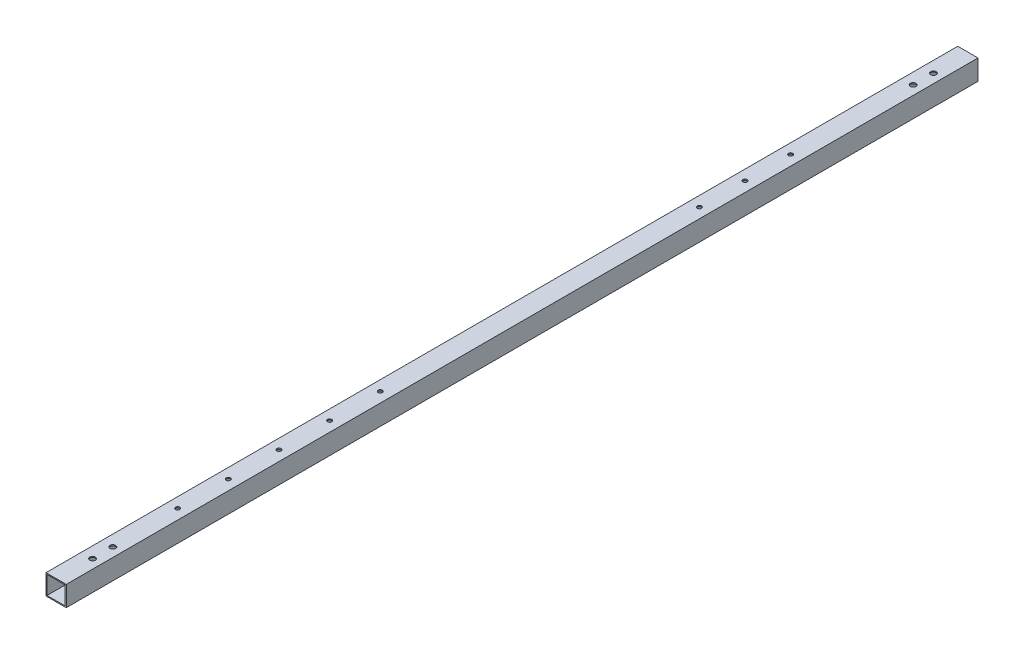
ISO-10303-21;
HEADER;
FILE_DESCRIPTION(('STEP AP214'),'2;1');
FILE_NAME('part.step','',(''),(''),'','','');
FILE_SCHEMA(('AUTOMOTIVE_DESIGN { 1 0 10303 214 1 1 1 1 }'));
ENDSEC;
DATA;
#1=APPLICATION_CONTEXT('core data for automotive mechanical design processes');
#2=APPLICATION_PROTOCOL_DEFINITION('international standard','automotive_design',2000,#1);
#3=PRODUCT_CONTEXT('',#1,'mechanical');
#4=PRODUCT('Part','Part','',(#3));
#5=PRODUCT_RELATED_PRODUCT_CATEGORY('part','',(#4));
#6=PRODUCT_DEFINITION_FORMATION('','',#4);
#7=PRODUCT_DEFINITION_CONTEXT('part definition',#1,'design');
#8=PRODUCT_DEFINITION('design','',#6,#7);
#9=PRODUCT_DEFINITION_SHAPE('','',#8);
#10=(LENGTH_UNIT() NAMED_UNIT(*) SI_UNIT(.MILLI.,.METRE.));
#11=(NAMED_UNIT(*) PLANE_ANGLE_UNIT() SI_UNIT($,.RADIAN.));
#12=(NAMED_UNIT(*) SI_UNIT($,.STERADIAN.) SOLID_ANGLE_UNIT());
#13=UNCERTAINTY_MEASURE_WITH_UNIT(LENGTH_MEASURE(1.E-05),#10,'distance_accuracy_value','');
#14=(GEOMETRIC_REPRESENTATION_CONTEXT(3) GLOBAL_UNCERTAINTY_ASSIGNED_CONTEXT((#13)) GLOBAL_UNIT_ASSIGNED_CONTEXT((#10,
#11,#12)) REPRESENTATION_CONTEXT('',''));
#15=CARTESIAN_POINT('',(0.,0.,0.));
#16=DIRECTION('',(0.,0.,1.));
#17=DIRECTION('',(1.,0.,0.));
#18=AXIS2_PLACEMENT_3D('',#15,#16,#17);
#19=CARTESIAN_POINT('',(0.,0.,900.));
#20=DIRECTION('',(0.,0.,1.));
#21=DIRECTION('',(1.,0.,0.));
#22=AXIS2_PLACEMENT_3D('',#19,#20,#21);
#23=PLANE('',#22);
#24=DIRECTION('',(0.,-1.,0.));
#25=VECTOR('',#24,1.);
#26=CARTESIAN_POINT('',(0.,0.,900.));
#27=LINE('',#26,#25);
#28=CARTESIAN_POINT('',(0.,0.,900.));
#29=VERTEX_POINT('',#28);
#30=CARTESIAN_POINT('',(0.,-20.,900.));
#31=VERTEX_POINT('',#30);
#32=EDGE_CURVE('E170',#29,#31,#27,.T.);
#33=ORIENTED_EDGE('',*,*,#32,.T.);
#34=DIRECTION('',(1.,0.,0.));
#35=VECTOR('',#34,1.);
#36=CARTESIAN_POINT('',(0.,-20.,900.));
#37=LINE('',#36,#35);
#38=CARTESIAN_POINT('',(20.,-20.,900.));
#39=VERTEX_POINT('',#38);
#40=EDGE_CURVE('E173',#31,#39,#37,.T.);
#41=ORIENTED_EDGE('',*,*,#40,.T.);
#42=DIRECTION('',(0.,1.,0.));
#43=VECTOR('',#42,1.);
#44=CARTESIAN_POINT('',(20.,0.,900.));
#45=LINE('',#44,#43);
#46=CARTESIAN_POINT('',(20.,0.,900.));
#47=VERTEX_POINT('',#46);
#48=EDGE_CURVE('E176',#39,#47,#45,.T.);
#49=ORIENTED_EDGE('',*,*,#48,.T.);
#50=DIRECTION('',(-1.,0.,0.));
#51=VECTOR('',#50,1.);
#52=CARTESIAN_POINT('',(0.,0.,900.));
#53=LINE('',#52,#51);
#54=EDGE_CURVE('E178',#47,#29,#53,.T.);
#55=ORIENTED_EDGE('',*,*,#54,.T.);
#56=EDGE_LOOP('',(#33,#41,#49,#55));
#57=FACE_BOUND('',#56,.T.);
#58=DIRECTION('',(1.,0.,0.));
#59=VECTOR('',#58,1.);
#60=CARTESIAN_POINT('',(0.,-19.,900.));
#61=LINE('',#60,#59);
#62=CARTESIAN_POINT('',(1.,-19.,900.));
#63=VERTEX_POINT('',#62);
#64=CARTESIAN_POINT('',(19.,-19.,900.));
#65=VERTEX_POINT('',#64);
#66=EDGE_CURVE('E140',#63,#65,#61,.T.);
#67=ORIENTED_EDGE('',*,*,#66,.F.);
#68=DIRECTION('',(0.,-1.,0.));
#69=VECTOR('',#68,1.);
#70=CARTESIAN_POINT('',(1.,0.,900.));
#71=LINE('',#70,#69);
#72=CARTESIAN_POINT('',(1.,-1.,900.));
#73=VERTEX_POINT('',#72);
#74=EDGE_CURVE('E132',#73,#63,#71,.T.);
#75=ORIENTED_EDGE('',*,*,#74,.F.);
#76=DIRECTION('',(-1.,0.,0.));
#77=VECTOR('',#76,1.);
#78=CARTESIAN_POINT('',(0.,-1.,900.));
#79=LINE('',#78,#77);
#80=CARTESIAN_POINT('',(19.,-1.,900.));
#81=VERTEX_POINT('',#80);
#82=EDGE_CURVE('E154',#81,#73,#79,.T.);
#83=ORIENTED_EDGE('',*,*,#82,.F.);
#84=DIRECTION('',(0.,1.,0.));
#85=VECTOR('',#84,1.);
#86=CARTESIAN_POINT('',(19.,0.,900.));
#87=LINE('',#86,#85);
#88=EDGE_CURVE('E152',#65,#81,#87,.T.);
#89=ORIENTED_EDGE('',*,*,#88,.F.);
#90=EDGE_LOOP('',(#67,#75,#83,#89));
#91=FACE_BOUND('',#90,.T.);
#92=ADVANCED_FACE('F65',(#57,#91),#23,.T.);
#93=CARTESIAN_POINT('',(0.,0.,0.));
#94=DIRECTION('',(0.,0.,1.));
#95=DIRECTION('',(1.,0.,0.));
#96=AXIS2_PLACEMENT_3D('',#93,#94,#95);
#97=PLANE('',#96);
#98=DIRECTION('',(0.,-1.,0.));
#99=VECTOR('',#98,1.);
#100=CARTESIAN_POINT('',(0.,0.,0.));
#101=LINE('',#100,#99);
#102=CARTESIAN_POINT('',(0.,0.,0.));
#103=VERTEX_POINT('',#102);
#104=CARTESIAN_POINT('',(0.,-20.,0.));
#105=VERTEX_POINT('',#104);
#106=EDGE_CURVE('E148',#103,#105,#101,.T.);
#107=ORIENTED_EDGE('',*,*,#106,.F.);
#108=DIRECTION('',(-1.,0.,0.));
#109=VECTOR('',#108,1.);
#110=CARTESIAN_POINT('',(0.,0.,0.));
#111=LINE('',#110,#109);
#112=CARTESIAN_POINT('',(20.,0.,0.));
#113=VERTEX_POINT('',#112);
#114=EDGE_CURVE('E174',#113,#103,#111,.T.);
#115=ORIENTED_EDGE('',*,*,#114,.F.);
#116=DIRECTION('',(0.,1.,0.));
#117=VECTOR('',#116,1.);
#118=CARTESIAN_POINT('',(20.,0.,0.));
#119=LINE('',#118,#117);
#120=CARTESIAN_POINT('',(20.,-20.,0.));
#121=VERTEX_POINT('',#120);
#122=EDGE_CURVE('E185',#121,#113,#119,.T.);
#123=ORIENTED_EDGE('',*,*,#122,.F.);
#124=DIRECTION('',(1.,0.,0.));
#125=VECTOR('',#124,1.);
#126=CARTESIAN_POINT('',(0.,-20.,0.));
#127=LINE('',#126,#125);
#128=EDGE_CURVE('E183',#105,#121,#127,.T.);
#129=ORIENTED_EDGE('',*,*,#128,.F.);
#130=EDGE_LOOP('',(#107,#115,#123,#129));
#131=FACE_BOUND('',#130,.T.);
#132=DIRECTION('',(0.,-1.,0.));
#133=VECTOR('',#132,1.);
#134=CARTESIAN_POINT('',(1.,0.,0.));
#135=LINE('',#134,#133);
#136=CARTESIAN_POINT('',(1.,-1.,0.));
#137=VERTEX_POINT('',#136);
#138=CARTESIAN_POINT('',(1.,-19.,0.));
#139=VERTEX_POINT('',#138);
#140=EDGE_CURVE('E90',#137,#139,#135,.T.);
#141=ORIENTED_EDGE('',*,*,#140,.T.);
#142=DIRECTION('',(1.,0.,0.));
#143=VECTOR('',#142,1.);
#144=CARTESIAN_POINT('',(0.,-19.,0.));
#145=LINE('',#144,#143);
#146=CARTESIAN_POINT('',(19.,-19.,0.));
#147=VERTEX_POINT('',#146);
#148=EDGE_CURVE('E147',#139,#147,#145,.T.);
#149=ORIENTED_EDGE('',*,*,#148,.T.);
#150=DIRECTION('',(0.,1.,0.));
#151=VECTOR('',#150,1.);
#152=CARTESIAN_POINT('',(19.,0.,0.));
#153=LINE('',#152,#151);
#154=CARTESIAN_POINT('',(19.,-1.,0.));
#155=VERTEX_POINT('',#154);
#156=EDGE_CURVE('E162',#147,#155,#153,.T.);
#157=ORIENTED_EDGE('',*,*,#156,.T.);
#158=DIRECTION('',(-1.,0.,0.));
#159=VECTOR('',#158,1.);
#160=CARTESIAN_POINT('',(0.,-1.,0.));
#161=LINE('',#160,#159);
#162=EDGE_CURVE('E141',#155,#137,#161,.T.);
#163=ORIENTED_EDGE('',*,*,#162,.T.);
#164=EDGE_LOOP('',(#141,#149,#157,#163));
#165=FACE_BOUND('',#164,.T.);
#166=ADVANCED_FACE('F343',(#131,#165),#97,.F.);
#167=CARTESIAN_POINT('',(0.,0.,900.));
#168=DIRECTION('',(1.,0.,0.));
#169=DIRECTION('',(0.,1.,0.));
#170=AXIS2_PLACEMENT_3D('',#167,#168,#169);
#171=PLANE('',#170);
#172=ORIENTED_EDGE('',*,*,#106,.T.);
#173=DIRECTION('',(0.,0.,-1.));
#174=VECTOR('',#173,1.);
#175=CARTESIAN_POINT('',(0.,-20.,900.));
#176=LINE('',#175,#174);
#177=EDGE_CURVE('E12',#31,#105,#176,.T.);
#178=ORIENTED_EDGE('',*,*,#177,.F.);
#179=ORIENTED_EDGE('',*,*,#32,.F.);
#180=DIRECTION('',(0.,0.,-1.));
#181=VECTOR('',#180,1.);
#182=CARTESIAN_POINT('',(0.,0.,900.));
#183=LINE('',#182,#181);
#184=EDGE_CURVE('E180',#29,#103,#183,.T.);
#185=ORIENTED_EDGE('',*,*,#184,.T.);
#186=EDGE_LOOP('',(#172,#178,#179,#185));
#187=FACE_BOUND('',#186,.T.);
#188=ADVANCED_FACE('F67',(#187),#171,.F.);
#189=CARTESIAN_POINT('',(0.,-20.,900.));
#190=DIRECTION('',(0.,1.,0.));
#191=DIRECTION('',(0.,0.,1.));
#192=AXIS2_PLACEMENT_3D('',#189,#190,#191);
#193=PLANE('',#192);
#194=CARTESIAN_POINT('',(10.,-20.,780.));
#195=DIRECTION('',(0.,1.,0.));
#196=DIRECTION('',(0.,0.,1.));
#197=AXIS2_PLACEMENT_3D('',#194,#195,#196);
#198=CIRCLE('',#197,2.10000000000005);
#199=CARTESIAN_POINT('',(10.,-20.,782.1));
#200=VERTEX_POINT('',#199);
#201=EDGE_CURVE('E266',#200,#200,#198,.T.);
#202=ORIENTED_EDGE('',*,*,#201,.T.);
#203=EDGE_LOOP('',(#202));
#204=FACE_BOUND('',#203,.T.);
#205=CARTESIAN_POINT('',(9.99999999999983,-20.,730.));
#206=DIRECTION('',(0.,1.,0.));
#207=DIRECTION('',(0.,0.,1.));
#208=AXIS2_PLACEMENT_3D('',#205,#206,#207);
#209=CIRCLE('',#208,2.10000000000005);
#210=CARTESIAN_POINT('',(9.99999999999983,-20.,732.1));
#211=VERTEX_POINT('',#210);
#212=EDGE_CURVE('E251',#211,#211,#209,.T.);
#213=ORIENTED_EDGE('',*,*,#212,.T.);
#214=EDGE_LOOP('',(#213));
#215=FACE_BOUND('',#214,.T.);
#216=CARTESIAN_POINT('',(9.99999999999966,-20.,680.));
#217=DIRECTION('',(0.,1.,0.));
#218=DIRECTION('',(0.,0.,1.));
#219=AXIS2_PLACEMENT_3D('',#216,#217,#218);
#220=CIRCLE('',#219,2.10000000000005);
#221=CARTESIAN_POINT('',(9.99999999999966,-20.,682.1));
#222=VERTEX_POINT('',#221);
#223=EDGE_CURVE('E247',#222,#222,#220,.T.);
#224=ORIENTED_EDGE('',*,*,#223,.T.);
#225=EDGE_LOOP('',(#224));
#226=FACE_BOUND('',#225,.T.);
#227=CARTESIAN_POINT('',(9.99999999999948,-20.,630.));
#228=DIRECTION('',(0.,1.,0.));
#229=DIRECTION('',(0.,0.,1.));
#230=AXIS2_PLACEMENT_3D('',#227,#228,#229);
#231=CIRCLE('',#230,2.10000000000005);
#232=CARTESIAN_POINT('',(9.99999999999948,-20.,632.1));
#233=VERTEX_POINT('',#232);
#234=EDGE_CURVE('E243',#233,#233,#231,.T.);
#235=ORIENTED_EDGE('',*,*,#234,.T.);
#236=EDGE_LOOP('',(#235));
#237=FACE_BOUND('',#236,.T.);
#238=CARTESIAN_POINT('',(9.99999999999931,-20.,580.));
#239=DIRECTION('',(0.,1.,0.));
#240=DIRECTION('',(0.,0.,1.));
#241=AXIS2_PLACEMENT_3D('',#238,#239,#240);
#242=CIRCLE('',#241,2.10000000000008);
#243=CARTESIAN_POINT('',(9.99999999999931,-20.,582.1));
#244=VERTEX_POINT('',#243);
#245=EDGE_CURVE('E239',#244,#244,#242,.T.);
#246=ORIENTED_EDGE('',*,*,#245,.T.);
#247=EDGE_LOOP('',(#246));
#248=FACE_BOUND('',#247,.T.);
#249=CARTESIAN_POINT('',(10.,-20.,175.));
#250=DIRECTION('',(0.,1.,0.));
#251=DIRECTION('',(0.,0.,1.));
#252=AXIS2_PLACEMENT_3D('',#249,#250,#251);
#253=CIRCLE('',#252,2.09999999999999);
#254=CARTESIAN_POINT('',(10.,-20.,177.1));
#255=VERTEX_POINT('',#254);
#256=EDGE_CURVE('E287',#255,#255,#253,.T.);
#257=ORIENTED_EDGE('',*,*,#256,.T.);
#258=EDGE_LOOP('',(#257));
#259=FACE_BOUND('',#258,.T.);
#260=CARTESIAN_POINT('',(10.0000000000005,-20.,220.));
#261=DIRECTION('',(0.,1.,0.));
#262=DIRECTION('',(0.,0.,1.));
#263=AXIS2_PLACEMENT_3D('',#260,#261,#262);
#264=CIRCLE('',#263,2.09999999999999);
#265=CARTESIAN_POINT('',(10.0000000000005,-20.,222.1));
#266=VERTEX_POINT('',#265);
#267=EDGE_CURVE('E229',#266,#266,#264,.T.);
#268=ORIENTED_EDGE('',*,*,#267,.T.);
#269=EDGE_LOOP('',(#268));
#270=FACE_BOUND('',#269,.T.);
#271=CARTESIAN_POINT('',(10.0000000000009,-20.,265.));
#272=DIRECTION('',(0.,1.,0.));
#273=DIRECTION('',(0.,0.,1.));
#274=AXIS2_PLACEMENT_3D('',#271,#272,#273);
#275=CIRCLE('',#274,2.09999999999999);
#276=CARTESIAN_POINT('',(10.0000000000009,-20.,267.1));
#277=VERTEX_POINT('',#276);
#278=EDGE_CURVE('E224',#277,#277,#275,.T.);
#279=ORIENTED_EDGE('',*,*,#278,.T.);
#280=EDGE_LOOP('',(#279));
#281=FACE_BOUND('',#280,.T.);
#282=CARTESIAN_POINT('',(11.,-20.,35.));
#283=DIRECTION('',(0.,1.,0.));
#284=DIRECTION('',(0.,0.,1.));
#285=AXIS2_PLACEMENT_3D('',#282,#283,#284);
#286=CIRCLE('',#285,2.75);
#287=CARTESIAN_POINT('',(11.,-20.,37.75));
#288=VERTEX_POINT('',#287);
#289=EDGE_CURVE('E160',#288,#288,#286,.T.);
#290=ORIENTED_EDGE('',*,*,#289,.T.);
#291=EDGE_LOOP('',(#290));
#292=FACE_BOUND('',#291,.T.);
#293=CARTESIAN_POINT('',(11.0000000000002,-20.,55.));
#294=DIRECTION('',(0.,1.,0.));
#295=DIRECTION('',(0.,0.,1.));
#296=AXIS2_PLACEMENT_3D('',#293,#294,#295);
#297=CIRCLE('',#296,2.75);
#298=CARTESIAN_POINT('',(11.0000000000002,-20.,57.75));
#299=VERTEX_POINT('',#298);
#300=EDGE_CURVE('E214',#299,#299,#297,.T.);
#301=ORIENTED_EDGE('',*,*,#300,.T.);
#302=EDGE_LOOP('',(#301));
#303=FACE_BOUND('',#302,.T.);
#304=CARTESIAN_POINT('',(11.0000000000003,-20.,845.));
#305=DIRECTION('',(0.,1.,0.));
#306=DIRECTION('',(0.,0.,1.));
#307=AXIS2_PLACEMENT_3D('',#304,#305,#306);
#308=CIRCLE('',#307,2.74999999999998);
#309=CARTESIAN_POINT('',(11.0000000000003,-20.,847.75));
#310=VERTEX_POINT('',#309);
#311=EDGE_CURVE('E209',#310,#310,#308,.T.);
#312=ORIENTED_EDGE('',*,*,#311,.T.);
#313=EDGE_LOOP('',(#312));
#314=FACE_BOUND('',#313,.T.);
#315=CARTESIAN_POINT('',(11.0000000000001,-20.,865.));
#316=DIRECTION('',(0.,1.,0.));
#317=DIRECTION('',(0.,0.,1.));
#318=AXIS2_PLACEMENT_3D('',#315,#316,#317);
#319=CIRCLE('',#318,2.74999999999998);
#320=CARTESIAN_POINT('',(11.0000000000001,-20.,867.75));
#321=VERTEX_POINT('',#320);
#322=EDGE_CURVE('E204',#321,#321,#319,.T.);
#323=ORIENTED_EDGE('',*,*,#322,.T.);
#324=EDGE_LOOP('',(#323));
#325=FACE_BOUND('',#324,.T.);
#326=ORIENTED_EDGE('',*,*,#128,.T.);
#327=DIRECTION('',(0.,0.,-1.));
#328=VECTOR('',#327,1.);
#329=CARTESIAN_POINT('',(20.,-20.,900.));
#330=LINE('',#329,#328);
#331=EDGE_CURVE('E74',#39,#121,#330,.T.);
#332=ORIENTED_EDGE('',*,*,#331,.F.);
#333=ORIENTED_EDGE('',*,*,#40,.F.);
#334=ORIENTED_EDGE('',*,*,#177,.T.);
#335=EDGE_LOOP('',(#326,#332,#333,#334));
#336=FACE_BOUND('',#335,.T.);
#337=ADVANCED_FACE('F317',(#204,#215,#226,#237,#248,#259,#270,#281,#292,#303,#314,#325,#336),
#193,.F.);
#338=CARTESIAN_POINT('',(20.,0.,900.));
#339=DIRECTION('',(-1.,0.,0.));
#340=DIRECTION('',(0.,-1.,0.));
#341=AXIS2_PLACEMENT_3D('',#338,#339,#340);
#342=PLANE('',#341);
#343=ORIENTED_EDGE('',*,*,#122,.T.);
#344=DIRECTION('',(0.,0.,-1.));
#345=VECTOR('',#344,1.);
#346=CARTESIAN_POINT('',(20.,0.,900.));
#347=LINE('',#346,#345);
#348=EDGE_CURVE('E190',#47,#113,#347,.T.);
#349=ORIENTED_EDGE('',*,*,#348,.F.);
#350=ORIENTED_EDGE('',*,*,#48,.F.);
#351=ORIENTED_EDGE('',*,*,#331,.T.);
#352=EDGE_LOOP('',(#343,#349,#350,#351));
#353=FACE_BOUND('',#352,.T.);
#354=ADVANCED_FACE('F357',(#353),#342,.F.);
#355=CARTESIAN_POINT('',(0.,0.,900.));
#356=DIRECTION('',(0.,-1.,0.));
#357=DIRECTION('',(0.,0.,-1.));
#358=AXIS2_PLACEMENT_3D('',#355,#356,#357);
#359=PLANE('',#358);
#360=CARTESIAN_POINT('',(10.,0.,780.));
#361=DIRECTION('',(0.,1.,0.));
#362=DIRECTION('',(0.,0.,1.));
#363=AXIS2_PLACEMENT_3D('',#360,#361,#362);
#364=CIRCLE('',#363,2.10000000000005);
#365=CARTESIAN_POINT('',(10.,0.,782.1));
#366=VERTEX_POINT('',#365);
#367=EDGE_CURVE('E234',#366,#366,#364,.T.);
#368=ORIENTED_EDGE('',*,*,#367,.F.);
#369=EDGE_LOOP('',(#368));
#370=FACE_BOUND('',#369,.T.);
#371=CARTESIAN_POINT('',(9.99999999999983,0.,730.));
#372=DIRECTION('',(0.,1.,0.));
#373=DIRECTION('',(0.,0.,1.));
#374=AXIS2_PLACEMENT_3D('',#371,#372,#373);
#375=CIRCLE('',#374,2.10000000000005);
#376=CARTESIAN_POINT('',(9.99999999999983,0.,732.1));
#377=VERTEX_POINT('',#376);
#378=EDGE_CURVE('E663',#377,#377,#375,.T.);
#379=ORIENTED_EDGE('',*,*,#378,.F.);
#380=EDGE_LOOP('',(#379));
#381=FACE_BOUND('',#380,.T.);
#382=CARTESIAN_POINT('',(9.99999999999966,0.,680.));
#383=DIRECTION('',(0.,1.,0.));
#384=DIRECTION('',(0.,0.,1.));
#385=AXIS2_PLACEMENT_3D('',#382,#383,#384);
#386=CIRCLE('',#385,2.10000000000005);
#387=CARTESIAN_POINT('',(9.99999999999966,0.,682.1));
#388=VERTEX_POINT('',#387);
#389=EDGE_CURVE('E660',#388,#388,#386,.T.);
#390=ORIENTED_EDGE('',*,*,#389,.F.);
#391=EDGE_LOOP('',(#390));
#392=FACE_BOUND('',#391,.T.);
#393=CARTESIAN_POINT('',(9.99999999999948,0.,630.));
#394=DIRECTION('',(0.,1.,0.));
#395=DIRECTION('',(0.,0.,1.));
#396=AXIS2_PLACEMENT_3D('',#393,#394,#395);
#397=CIRCLE('',#396,2.10000000000005);
#398=CARTESIAN_POINT('',(9.99999999999948,0.,632.1));
#399=VERTEX_POINT('',#398);
#400=EDGE_CURVE('E657',#399,#399,#397,.T.);
#401=ORIENTED_EDGE('',*,*,#400,.F.);
#402=EDGE_LOOP('',(#401));
#403=FACE_BOUND('',#402,.T.);
#404=CARTESIAN_POINT('',(9.99999999999931,0.,580.));
#405=DIRECTION('',(0.,1.,0.));
#406=DIRECTION('',(0.,0.,1.));
#407=AXIS2_PLACEMENT_3D('',#404,#405,#406);
#408=CIRCLE('',#407,2.10000000000008);
#409=CARTESIAN_POINT('',(9.99999999999931,0.,582.1));
#410=VERTEX_POINT('',#409);
#411=EDGE_CURVE('E654',#410,#410,#408,.T.);
#412=ORIENTED_EDGE('',*,*,#411,.F.);
#413=EDGE_LOOP('',(#412));
#414=FACE_BOUND('',#413,.T.);
#415=CARTESIAN_POINT('',(10.,0.,175.));
#416=DIRECTION('',(0.,1.,0.));
#417=DIRECTION('',(0.,0.,1.));
#418=AXIS2_PLACEMENT_3D('',#415,#416,#417);
#419=CIRCLE('',#418,2.09999999999999);
#420=CARTESIAN_POINT('',(10.,0.,177.1));
#421=VERTEX_POINT('',#420);
#422=EDGE_CURVE('E219',#421,#421,#419,.T.);
#423=ORIENTED_EDGE('',*,*,#422,.F.);
#424=EDGE_LOOP('',(#423));
#425=FACE_BOUND('',#424,.T.);
#426=CARTESIAN_POINT('',(10.0000000000005,0.,220.));
#427=DIRECTION('',(0.,1.,0.));
#428=DIRECTION('',(0.,0.,1.));
#429=AXIS2_PLACEMENT_3D('',#426,#427,#428);
#430=CIRCLE('',#429,2.09999999999999);
#431=CARTESIAN_POINT('',(10.0000000000005,0.,222.1));
#432=VERTEX_POINT('',#431);
#433=EDGE_CURVE('E272',#432,#432,#430,.T.);
#434=ORIENTED_EDGE('',*,*,#433,.F.);
#435=EDGE_LOOP('',(#434));
#436=FACE_BOUND('',#435,.T.);
#437=CARTESIAN_POINT('',(10.0000000000009,0.,265.));
#438=DIRECTION('',(0.,1.,0.));
#439=DIRECTION('',(0.,0.,1.));
#440=AXIS2_PLACEMENT_3D('',#437,#438,#439);
#441=CIRCLE('',#440,2.09999999999999);
#442=CARTESIAN_POINT('',(10.0000000000009,0.,267.1));
#443=VERTEX_POINT('',#442);
#444=EDGE_CURVE('E269',#443,#443,#441,.T.);
#445=ORIENTED_EDGE('',*,*,#444,.F.);
#446=EDGE_LOOP('',(#445));
#447=FACE_BOUND('',#446,.T.);
#448=CARTESIAN_POINT('',(11.,0.,35.));
#449=DIRECTION('',(0.,1.,0.));
#450=DIRECTION('',(0.,0.,1.));
#451=AXIS2_PLACEMENT_3D('',#448,#449,#450);
#452=CIRCLE('',#451,2.75);
#453=CARTESIAN_POINT('',(11.,0.,37.75));
#454=VERTEX_POINT('',#453);
#455=EDGE_CURVE('E199',#454,#454,#452,.T.);
#456=ORIENTED_EDGE('',*,*,#455,.F.);
#457=EDGE_LOOP('',(#456));
#458=FACE_BOUND('',#457,.T.);
#459=CARTESIAN_POINT('',(11.0000000000002,0.,55.));
#460=DIRECTION('',(0.,1.,0.));
#461=DIRECTION('',(0.,0.,1.));
#462=AXIS2_PLACEMENT_3D('',#459,#460,#461);
#463=CIRCLE('',#462,2.75);
#464=CARTESIAN_POINT('',(11.0000000000002,0.,57.75));
#465=VERTEX_POINT('',#464);
#466=EDGE_CURVE('E293',#465,#465,#463,.T.);
#467=ORIENTED_EDGE('',*,*,#466,.F.);
#468=EDGE_LOOP('',(#467));
#469=FACE_BOUND('',#468,.T.);
#470=CARTESIAN_POINT('',(11.0000000000003,0.,845.));
#471=DIRECTION('',(0.,1.,0.));
#472=DIRECTION('',(0.,0.,-1.));
#473=AXIS2_PLACEMENT_3D('',#470,#471,#472);
#474=CIRCLE('',#473,2.74999999999998);
#475=CARTESIAN_POINT('',(11.0000000000003,0.,842.25));
#476=VERTEX_POINT('',#475);
#477=EDGE_CURVE('E296',#476,#476,#474,.T.);
#478=ORIENTED_EDGE('',*,*,#477,.F.);
#479=EDGE_LOOP('',(#478));
#480=FACE_BOUND('',#479,.T.);
#481=CARTESIAN_POINT('',(11.0000000000001,0.,865.));
#482=DIRECTION('',(0.,1.,0.));
#483=DIRECTION('',(0.,0.,-1.));
#484=AXIS2_PLACEMENT_3D('',#481,#482,#483);
#485=CIRCLE('',#484,2.74999999999998);
#486=CARTESIAN_POINT('',(11.0000000000001,0.,862.25));
#487=VERTEX_POINT('',#486);
#488=EDGE_CURVE('E290',#487,#487,#485,.T.);
#489=ORIENTED_EDGE('',*,*,#488,.F.);
#490=EDGE_LOOP('',(#489));
#491=FACE_BOUND('',#490,.T.);
#492=ORIENTED_EDGE('',*,*,#114,.T.);
#493=ORIENTED_EDGE('',*,*,#184,.F.);
#494=ORIENTED_EDGE('',*,*,#54,.F.);
#495=ORIENTED_EDGE('',*,*,#348,.T.);
#496=EDGE_LOOP('',(#492,#493,#494,#495));
#497=FACE_BOUND('',#496,.T.);
#498=ADVANCED_FACE('F354',(#370,#381,#392,#403,#414,#425,#436,#447,#458,#469,#480,#491,#497),
#359,.F.);
#499=CARTESIAN_POINT('',(1.,0.,900.));
#500=DIRECTION('',(1.,0.,0.));
#501=DIRECTION('',(0.,1.,0.));
#502=AXIS2_PLACEMENT_3D('',#499,#500,#501);
#503=PLANE('',#502);
#504=ORIENTED_EDGE('',*,*,#140,.F.);
#505=DIRECTION('',(0.,0.,-1.));
#506=VECTOR('',#505,1.);
#507=CARTESIAN_POINT('',(1.,-1.,900.));
#508=LINE('',#507,#506);
#509=EDGE_CURVE('E136',#73,#137,#508,.T.);
#510=ORIENTED_EDGE('',*,*,#509,.F.);
#511=ORIENTED_EDGE('',*,*,#74,.T.);
#512=DIRECTION('',(0.,0.,-1.));
#513=VECTOR('',#512,1.);
#514=CARTESIAN_POINT('',(1.,-19.,900.));
#515=LINE('',#514,#513);
#516=EDGE_CURVE('E135',#63,#139,#515,.T.);
#517=ORIENTED_EDGE('',*,*,#516,.T.);
#518=EDGE_LOOP('',(#504,#510,#511,#517));
#519=FACE_BOUND('',#518,.T.);
#520=ADVANCED_FACE('F134',(#519),#503,.T.);
#521=CARTESIAN_POINT('',(0.,-19.,900.));
#522=DIRECTION('',(0.,1.,0.));
#523=DIRECTION('',(0.,0.,1.));
#524=AXIS2_PLACEMENT_3D('',#521,#522,#523);
#525=PLANE('',#524);
#526=CARTESIAN_POINT('',(10.,-19.,780.));
#527=DIRECTION('',(0.,1.,0.));
#528=DIRECTION('',(0.,0.,1.));
#529=AXIS2_PLACEMENT_3D('',#526,#527,#528);
#530=CIRCLE('',#529,2.10000000000005);
#531=CARTESIAN_POINT('',(10.,-19.,782.1));
#532=VERTEX_POINT('',#531);
#533=EDGE_CURVE('E263',#532,#532,#530,.T.);
#534=ORIENTED_EDGE('',*,*,#533,.F.);
#535=EDGE_LOOP('',(#534));
#536=FACE_BOUND('',#535,.T.);
#537=CARTESIAN_POINT('',(9.99999999999983,-19.,730.));
#538=DIRECTION('',(0.,1.,0.));
#539=DIRECTION('',(0.,0.,1.));
#540=AXIS2_PLACEMENT_3D('',#537,#538,#539);
#541=CIRCLE('',#540,2.10000000000005);
#542=CARTESIAN_POINT('',(9.99999999999983,-19.,732.1));
#543=VERTEX_POINT('',#542);
#544=EDGE_CURVE('E246',#543,#543,#541,.T.);
#545=ORIENTED_EDGE('',*,*,#544,.F.);
#546=EDGE_LOOP('',(#545));
#547=FACE_BOUND('',#546,.T.);
#548=CARTESIAN_POINT('',(9.99999999999966,-19.,680.));
#549=DIRECTION('',(0.,1.,0.));
#550=DIRECTION('',(0.,0.,1.));
#551=AXIS2_PLACEMENT_3D('',#548,#549,#550);
#552=CIRCLE('',#551,2.10000000000005);
#553=CARTESIAN_POINT('',(9.99999999999966,-19.,682.1));
#554=VERTEX_POINT('',#553);
#555=EDGE_CURVE('E242',#554,#554,#552,.T.);
#556=ORIENTED_EDGE('',*,*,#555,.F.);
#557=EDGE_LOOP('',(#556));
#558=FACE_BOUND('',#557,.T.);
#559=CARTESIAN_POINT('',(9.99999999999948,-19.,630.));
#560=DIRECTION('',(0.,1.,0.));
#561=DIRECTION('',(0.,0.,1.));
#562=AXIS2_PLACEMENT_3D('',#559,#560,#561);
#563=CIRCLE('',#562,2.10000000000005);
#564=CARTESIAN_POINT('',(9.99999999999948,-19.,632.1));
#565=VERTEX_POINT('',#564);
#566=EDGE_CURVE('E238',#565,#565,#563,.T.);
#567=ORIENTED_EDGE('',*,*,#566,.F.);
#568=EDGE_LOOP('',(#567));
#569=FACE_BOUND('',#568,.T.);
#570=CARTESIAN_POINT('',(9.99999999999931,-19.,580.));
#571=DIRECTION('',(0.,1.,0.));
#572=DIRECTION('',(0.,0.,1.));
#573=AXIS2_PLACEMENT_3D('',#570,#571,#572);
#574=CIRCLE('',#573,2.10000000000008);
#575=CARTESIAN_POINT('',(9.99999999999931,-19.,582.1));
#576=VERTEX_POINT('',#575);
#577=EDGE_CURVE('E233',#576,#576,#574,.T.);
#578=ORIENTED_EDGE('',*,*,#577,.F.);
#579=EDGE_LOOP('',(#578));
#580=FACE_BOUND('',#579,.T.);
#581=CARTESIAN_POINT('',(10.,-19.,175.));
#582=DIRECTION('',(0.,1.,0.));
#583=DIRECTION('',(0.,0.,1.));
#584=AXIS2_PLACEMENT_3D('',#581,#582,#583);
#585=CIRCLE('',#584,2.09999999999999);
#586=CARTESIAN_POINT('',(10.,-19.,177.1));
#587=VERTEX_POINT('',#586);
#588=EDGE_CURVE('E228',#587,#587,#585,.T.);
#589=ORIENTED_EDGE('',*,*,#588,.F.);
#590=EDGE_LOOP('',(#589));
#591=FACE_BOUND('',#590,.T.);
#592=CARTESIAN_POINT('',(10.0000000000005,-19.,220.));
#593=DIRECTION('',(0.,1.,0.));
#594=DIRECTION('',(0.,0.,1.));
#595=AXIS2_PLACEMENT_3D('',#592,#593,#594);
#596=CIRCLE('',#595,2.09999999999999);
#597=CARTESIAN_POINT('',(10.0000000000005,-19.,222.1));
#598=VERTEX_POINT('',#597);
#599=EDGE_CURVE('E223',#598,#598,#596,.T.);
#600=ORIENTED_EDGE('',*,*,#599,.F.);
#601=EDGE_LOOP('',(#600));
#602=FACE_BOUND('',#601,.T.);
#603=CARTESIAN_POINT('',(10.0000000000009,-19.,265.));
#604=DIRECTION('',(0.,1.,0.));
#605=DIRECTION('',(0.,0.,1.));
#606=AXIS2_PLACEMENT_3D('',#603,#604,#605);
#607=CIRCLE('',#606,2.09999999999999);
#608=CARTESIAN_POINT('',(10.0000000000009,-19.,267.1));
#609=VERTEX_POINT('',#608);
#610=EDGE_CURVE('E218',#609,#609,#607,.T.);
#611=ORIENTED_EDGE('',*,*,#610,.F.);
#612=EDGE_LOOP('',(#611));
#613=FACE_BOUND('',#612,.T.);
#614=CARTESIAN_POINT('',(11.,-19.,35.));
#615=DIRECTION('',(0.,1.,0.));
#616=DIRECTION('',(0.,0.,1.));
#617=AXIS2_PLACEMENT_3D('',#614,#615,#616);
#618=CIRCLE('',#617,2.75);
#619=CARTESIAN_POINT('',(11.,-19.,37.75));
#620=VERTEX_POINT('',#619);
#621=EDGE_CURVE('E213',#620,#620,#618,.T.);
#622=ORIENTED_EDGE('',*,*,#621,.F.);
#623=EDGE_LOOP('',(#622));
#624=FACE_BOUND('',#623,.T.);
#625=CARTESIAN_POINT('',(11.0000000000002,-19.,55.));
#626=DIRECTION('',(0.,1.,0.));
#627=DIRECTION('',(0.,0.,1.));
#628=AXIS2_PLACEMENT_3D('',#625,#626,#627);
#629=CIRCLE('',#628,2.75);
#630=CARTESIAN_POINT('',(11.0000000000002,-19.,57.75));
#631=VERTEX_POINT('',#630);
#632=EDGE_CURVE('E208',#631,#631,#629,.T.);
#633=ORIENTED_EDGE('',*,*,#632,.F.);
#634=EDGE_LOOP('',(#633));
#635=FACE_BOUND('',#634,.T.);
#636=CARTESIAN_POINT('',(11.0000000000003,-19.,845.));
#637=DIRECTION('',(0.,1.,0.));
#638=DIRECTION('',(0.,0.,1.));
#639=AXIS2_PLACEMENT_3D('',#636,#637,#638);
#640=CIRCLE('',#639,2.74999999999998);
#641=CARTESIAN_POINT('',(11.0000000000003,-19.,847.75));
#642=VERTEX_POINT('',#641);
#643=EDGE_CURVE('E203',#642,#642,#640,.T.);
#644=ORIENTED_EDGE('',*,*,#643,.F.);
#645=EDGE_LOOP('',(#644));
#646=FACE_BOUND('',#645,.T.);
#647=CARTESIAN_POINT('',(11.0000000000001,-19.,865.));
#648=DIRECTION('',(0.,1.,0.));
#649=DIRECTION('',(0.,0.,1.));
#650=AXIS2_PLACEMENT_3D('',#647,#648,#649);
#651=CIRCLE('',#650,2.74999999999998);
#652=CARTESIAN_POINT('',(11.0000000000001,-19.,867.75));
#653=VERTEX_POINT('',#652);
#654=EDGE_CURVE('E198',#653,#653,#651,.T.);
#655=ORIENTED_EDGE('',*,*,#654,.F.);
#656=EDGE_LOOP('',(#655));
#657=FACE_BOUND('',#656,.T.);
#658=ORIENTED_EDGE('',*,*,#148,.F.);
#659=ORIENTED_EDGE('',*,*,#516,.F.);
#660=ORIENTED_EDGE('',*,*,#66,.T.);
#661=DIRECTION('',(0.,0.,-1.));
#662=VECTOR('',#661,1.);
#663=CARTESIAN_POINT('',(19.,-19.,900.));
#664=LINE('',#663,#662);
#665=EDGE_CURVE('E149',#65,#147,#664,.T.);
#666=ORIENTED_EDGE('',*,*,#665,.T.);
#667=EDGE_LOOP('',(#658,#659,#660,#666));
#668=FACE_BOUND('',#667,.T.);
#669=ADVANCED_FACE('F144',(#536,#547,#558,#569,#580,#591,#602,#613,#624,#635,#646,#657,#668),
#525,.T.);
#670=CARTESIAN_POINT('',(19.,0.,900.));
#671=DIRECTION('',(-1.,0.,0.));
#672=DIRECTION('',(0.,-1.,0.));
#673=AXIS2_PLACEMENT_3D('',#670,#671,#672);
#674=PLANE('',#673);
#675=ORIENTED_EDGE('',*,*,#156,.F.);
#676=ORIENTED_EDGE('',*,*,#665,.F.);
#677=ORIENTED_EDGE('',*,*,#88,.T.);
#678=DIRECTION('',(0.,0.,-1.));
#679=VECTOR('',#678,1.);
#680=CARTESIAN_POINT('',(19.,-1.,900.));
#681=LINE('',#680,#679);
#682=EDGE_CURVE('E82',#81,#155,#681,.T.);
#683=ORIENTED_EDGE('',*,*,#682,.T.);
#684=EDGE_LOOP('',(#675,#676,#677,#683));
#685=FACE_BOUND('',#684,.T.);
#686=ADVANCED_FACE('F440',(#685),#674,.T.);
#687=CARTESIAN_POINT('',(0.,-1.,900.));
#688=DIRECTION('',(0.,-1.,0.));
#689=DIRECTION('',(0.,0.,-1.));
#690=AXIS2_PLACEMENT_3D('',#687,#688,#689);
#691=PLANE('',#690);
#692=CARTESIAN_POINT('',(10.,-1.,780.));
#693=DIRECTION('',(0.,-1.,0.));
#694=DIRECTION('',(0.,0.,-1.));
#695=AXIS2_PLACEMENT_3D('',#692,#693,#694);
#696=CIRCLE('',#695,2.10000000000005);
#697=CARTESIAN_POINT('',(10.,-1.,777.9));
#698=VERTEX_POINT('',#697);
#699=EDGE_CURVE('E69',#698,#698,#696,.T.);
#700=ORIENTED_EDGE('',*,*,#699,.F.);
#701=EDGE_LOOP('',(#700));
#702=FACE_BOUND('',#701,.T.);
#703=CARTESIAN_POINT('',(9.99999999999983,-1.,730.));
#704=DIRECTION('',(0.,-1.,0.));
#705=DIRECTION('',(0.,0.,-1.));
#706=AXIS2_PLACEMENT_3D('',#703,#704,#705);
#707=CIRCLE('',#706,2.10000000000005);
#708=CARTESIAN_POINT('',(9.99999999999983,-1.,727.9));
#709=VERTEX_POINT('',#708);
#710=EDGE_CURVE('E244',#709,#709,#707,.T.);
#711=ORIENTED_EDGE('',*,*,#710,.F.);
#712=EDGE_LOOP('',(#711));
#713=FACE_BOUND('',#712,.T.);
#714=CARTESIAN_POINT('',(9.99999999999966,-1.,680.));
#715=DIRECTION('',(0.,-1.,0.));
#716=DIRECTION('',(0.,0.,-1.));
#717=AXIS2_PLACEMENT_3D('',#714,#715,#716);
#718=CIRCLE('',#717,2.10000000000005);
#719=CARTESIAN_POINT('',(9.99999999999966,-1.,677.9));
#720=VERTEX_POINT('',#719);
#721=EDGE_CURVE('E240',#720,#720,#718,.T.);
#722=ORIENTED_EDGE('',*,*,#721,.F.);
#723=EDGE_LOOP('',(#722));
#724=FACE_BOUND('',#723,.T.);
#725=CARTESIAN_POINT('',(9.99999999999948,-1.,630.));
#726=DIRECTION('',(0.,-1.,0.));
#727=DIRECTION('',(0.,0.,-1.));
#728=AXIS2_PLACEMENT_3D('',#725,#726,#727);
#729=CIRCLE('',#728,2.10000000000005);
#730=CARTESIAN_POINT('',(9.99999999999948,-1.,627.9));
#731=VERTEX_POINT('',#730);
#732=EDGE_CURVE('E235',#731,#731,#729,.T.);
#733=ORIENTED_EDGE('',*,*,#732,.F.);
#734=EDGE_LOOP('',(#733));
#735=FACE_BOUND('',#734,.T.);
#736=CARTESIAN_POINT('',(9.99999999999931,-1.,580.));
#737=DIRECTION('',(0.,-1.,0.));
#738=DIRECTION('',(0.,0.,-1.));
#739=AXIS2_PLACEMENT_3D('',#736,#737,#738);
#740=CIRCLE('',#739,2.10000000000008);
#741=CARTESIAN_POINT('',(9.99999999999931,-1.,577.9));
#742=VERTEX_POINT('',#741);
#743=EDGE_CURVE('E230',#742,#742,#740,.T.);
#744=ORIENTED_EDGE('',*,*,#743,.F.);
#745=EDGE_LOOP('',(#744));
#746=FACE_BOUND('',#745,.T.);
#747=CARTESIAN_POINT('',(10.,-1.,175.));
#748=DIRECTION('',(0.,-1.,0.));
#749=DIRECTION('',(0.,0.,-1.));
#750=AXIS2_PLACEMENT_3D('',#747,#748,#749);
#751=CIRCLE('',#750,2.09999999999999);
#752=CARTESIAN_POINT('',(10.,-1.,172.9));
#753=VERTEX_POINT('',#752);
#754=EDGE_CURVE('E225',#753,#753,#751,.T.);
#755=ORIENTED_EDGE('',*,*,#754,.F.);
#756=EDGE_LOOP('',(#755));
#757=FACE_BOUND('',#756,.T.);
#758=CARTESIAN_POINT('',(10.0000000000005,-1.,220.));
#759=DIRECTION('',(0.,-1.,0.));
#760=DIRECTION('',(0.,0.,-1.));
#761=AXIS2_PLACEMENT_3D('',#758,#759,#760);
#762=CIRCLE('',#761,2.09999999999999);
#763=CARTESIAN_POINT('',(10.0000000000005,-1.,217.9));
#764=VERTEX_POINT('',#763);
#765=EDGE_CURVE('E220',#764,#764,#762,.T.);
#766=ORIENTED_EDGE('',*,*,#765,.F.);
#767=EDGE_LOOP('',(#766));
#768=FACE_BOUND('',#767,.T.);
#769=CARTESIAN_POINT('',(10.0000000000009,-1.,265.));
#770=DIRECTION('',(0.,-1.,0.));
#771=DIRECTION('',(0.,0.,-1.));
#772=AXIS2_PLACEMENT_3D('',#769,#770,#771);
#773=CIRCLE('',#772,2.09999999999999);
#774=CARTESIAN_POINT('',(10.0000000000009,-1.,262.9));
#775=VERTEX_POINT('',#774);
#776=EDGE_CURVE('E215',#775,#775,#773,.T.);
#777=ORIENTED_EDGE('',*,*,#776,.F.);
#778=EDGE_LOOP('',(#777));
#779=FACE_BOUND('',#778,.T.);
#780=CARTESIAN_POINT('',(11.,-1.,35.));
#781=DIRECTION('',(0.,-1.,0.));
#782=DIRECTION('',(0.,0.,-1.));
#783=AXIS2_PLACEMENT_3D('',#780,#781,#782);
#784=CIRCLE('',#783,2.75);
#785=CARTESIAN_POINT('',(11.,-1.,32.25));
#786=VERTEX_POINT('',#785);
#787=EDGE_CURVE('E210',#786,#786,#784,.T.);
#788=ORIENTED_EDGE('',*,*,#787,.F.);
#789=EDGE_LOOP('',(#788));
#790=FACE_BOUND('',#789,.T.);
#791=CARTESIAN_POINT('',(11.0000000000002,-1.,55.));
#792=DIRECTION('',(0.,-1.,0.));
#793=DIRECTION('',(0.,0.,-1.));
#794=AXIS2_PLACEMENT_3D('',#791,#792,#793);
#795=CIRCLE('',#794,2.75);
#796=CARTESIAN_POINT('',(11.0000000000002,-1.,52.25));
#797=VERTEX_POINT('',#796);
#798=EDGE_CURVE('E205',#797,#797,#795,.T.);
#799=ORIENTED_EDGE('',*,*,#798,.F.);
#800=EDGE_LOOP('',(#799));
#801=FACE_BOUND('',#800,.T.);
#802=CARTESIAN_POINT('',(11.0000000000003,-1.,845.));
#803=DIRECTION('',(0.,-1.,0.));
#804=DIRECTION('',(0.,0.,-1.));
#805=AXIS2_PLACEMENT_3D('',#802,#803,#804);
#806=CIRCLE('',#805,2.74999999999998);
#807=CARTESIAN_POINT('',(11.0000000000003,-1.,842.25));
#808=VERTEX_POINT('',#807);
#809=EDGE_CURVE('E200',#808,#808,#806,.T.);
#810=ORIENTED_EDGE('',*,*,#809,.F.);
#811=EDGE_LOOP('',(#810));
#812=FACE_BOUND('',#811,.T.);
#813=CARTESIAN_POINT('',(11.0000000000001,-1.,865.));
#814=DIRECTION('',(0.,-1.,0.));
#815=DIRECTION('',(0.,0.,-1.));
#816=AXIS2_PLACEMENT_3D('',#813,#814,#815);
#817=CIRCLE('',#816,2.74999999999998);
#818=CARTESIAN_POINT('',(11.0000000000001,-1.,862.25));
#819=VERTEX_POINT('',#818);
#820=EDGE_CURVE('E195',#819,#819,#817,.T.);
#821=ORIENTED_EDGE('',*,*,#820,.F.);
#822=EDGE_LOOP('',(#821));
#823=FACE_BOUND('',#822,.T.);
#824=ORIENTED_EDGE('',*,*,#162,.F.);
#825=ORIENTED_EDGE('',*,*,#682,.F.);
#826=ORIENTED_EDGE('',*,*,#82,.T.);
#827=ORIENTED_EDGE('',*,*,#509,.T.);
#828=EDGE_LOOP('',(#824,#825,#826,#827));
#829=FACE_BOUND('',#828,.T.);
#830=ADVANCED_FACE('F485',(#702,#713,#724,#735,#746,#757,#768,#779,#790,#801,#812,#823,#829),
#691,.T.);
#831=CARTESIAN_POINT('',(11.0000000000001,-37.,865.));
#832=DIRECTION('',(0.,1.,0.));
#833=DIRECTION('',(0.,0.,1.));
#834=AXIS2_PLACEMENT_3D('',#831,#832,#833);
#835=CYLINDRICAL_SURFACE('',#834,2.74999999999998);
#836=ORIENTED_EDGE('',*,*,#820,.T.);
#837=EDGE_LOOP('',(#836));
#838=FACE_BOUND('',#837,.T.);
#839=ORIENTED_EDGE('',*,*,#488,.T.);
#840=EDGE_LOOP('',(#839));
#841=FACE_BOUND('',#840,.T.);
#842=ADVANCED_FACE('F468',(#838,#841),#835,.F.);
#843=CARTESIAN_POINT('',(11.0000000000003,-37.,845.));
#844=DIRECTION('',(0.,1.,0.));
#845=DIRECTION('',(0.,0.,1.));
#846=AXIS2_PLACEMENT_3D('',#843,#844,#845);
#847=CYLINDRICAL_SURFACE('',#846,2.74999999999998);
#848=ORIENTED_EDGE('',*,*,#809,.T.);
#849=EDGE_LOOP('',(#848));
#850=FACE_BOUND('',#849,.T.);
#851=ORIENTED_EDGE('',*,*,#477,.T.);
#852=EDGE_LOOP('',(#851));
#853=FACE_BOUND('',#852,.T.);
#854=ADVANCED_FACE('F492',(#850,#853),#847,.F.);
#855=CARTESIAN_POINT('',(11.0000000000002,-37.,55.));
#856=DIRECTION('',(0.,1.,0.));
#857=DIRECTION('',(0.,0.,1.));
#858=AXIS2_PLACEMENT_3D('',#855,#856,#857);
#859=CYLINDRICAL_SURFACE('',#858,2.75);
#860=ORIENTED_EDGE('',*,*,#798,.T.);
#861=EDGE_LOOP('',(#860));
#862=FACE_BOUND('',#861,.T.);
#863=ORIENTED_EDGE('',*,*,#466,.T.);
#864=EDGE_LOOP('',(#863));
#865=FACE_BOUND('',#864,.T.);
#866=ADVANCED_FACE('F338',(#862,#865),#859,.F.);
#867=CARTESIAN_POINT('',(11.,-37.,35.));
#868=DIRECTION('',(0.,1.,0.));
#869=DIRECTION('',(0.,0.,1.));
#870=AXIS2_PLACEMENT_3D('',#867,#868,#869);
#871=CYLINDRICAL_SURFACE('',#870,2.75);
#872=ORIENTED_EDGE('',*,*,#787,.T.);
#873=EDGE_LOOP('',(#872));
#874=FACE_BOUND('',#873,.T.);
#875=ORIENTED_EDGE('',*,*,#455,.T.);
#876=EDGE_LOOP('',(#875));
#877=FACE_BOUND('',#876,.T.);
#878=ADVANCED_FACE('F326',(#874,#877),#871,.F.);
#879=ORIENTED_EDGE('',*,*,#654,.T.);
#880=EDGE_LOOP('',(#879));
#881=FACE_BOUND('',#880,.T.);
#882=ORIENTED_EDGE('',*,*,#322,.F.);
#883=EDGE_LOOP('',(#882));
#884=FACE_BOUND('',#883,.T.);
#885=ADVANCED_FACE('F340',(#881,#884),#835,.F.);
#886=ORIENTED_EDGE('',*,*,#643,.T.);
#887=EDGE_LOOP('',(#886));
#888=FACE_BOUND('',#887,.T.);
#889=ORIENTED_EDGE('',*,*,#311,.F.);
#890=EDGE_LOOP('',(#889));
#891=FACE_BOUND('',#890,.T.);
#892=ADVANCED_FACE('F335',(#888,#891),#847,.F.);
#893=ORIENTED_EDGE('',*,*,#632,.T.);
#894=EDGE_LOOP('',(#893));
#895=FACE_BOUND('',#894,.T.);
#896=ORIENTED_EDGE('',*,*,#300,.F.);
#897=EDGE_LOOP('',(#896));
#898=FACE_BOUND('',#897,.T.);
#899=ADVANCED_FACE('F323',(#895,#898),#859,.F.);
#900=ORIENTED_EDGE('',*,*,#621,.T.);
#901=EDGE_LOOP('',(#900));
#902=FACE_BOUND('',#901,.T.);
#903=ORIENTED_EDGE('',*,*,#289,.F.);
#904=EDGE_LOOP('',(#903));
#905=FACE_BOUND('',#904,.T.);
#906=ADVANCED_FACE('F320',(#902,#905),#871,.F.);
#907=CARTESIAN_POINT('',(10.0000000000009,-37.,265.));
#908=DIRECTION('',(0.,1.,0.));
#909=DIRECTION('',(0.,0.,1.));
#910=AXIS2_PLACEMENT_3D('',#907,#908,#909);
#911=CYLINDRICAL_SURFACE('',#910,2.09999999999999);
#912=ORIENTED_EDGE('',*,*,#776,.T.);
#913=EDGE_LOOP('',(#912));
#914=FACE_BOUND('',#913,.T.);
#915=ORIENTED_EDGE('',*,*,#444,.T.);
#916=EDGE_LOOP('',(#915));
#917=FACE_BOUND('',#916,.T.);
#918=ADVANCED_FACE('F322',(#914,#917),#911,.F.);
#919=CARTESIAN_POINT('',(10.0000000000005,-37.,220.));
#920=DIRECTION('',(0.,1.,0.));
#921=DIRECTION('',(0.,0.,1.));
#922=AXIS2_PLACEMENT_3D('',#919,#920,#921);
#923=CYLINDRICAL_SURFACE('',#922,2.09999999999999);
#924=ORIENTED_EDGE('',*,*,#765,.T.);
#925=EDGE_LOOP('',(#924));
#926=FACE_BOUND('',#925,.T.);
#927=ORIENTED_EDGE('',*,*,#433,.T.);
#928=EDGE_LOOP('',(#927));
#929=FACE_BOUND('',#928,.T.);
#930=ADVANCED_FACE('F331',(#926,#929),#923,.F.);
#931=CARTESIAN_POINT('',(10.,-37.,175.));
#932=DIRECTION('',(0.,1.,0.));
#933=DIRECTION('',(0.,0.,1.));
#934=AXIS2_PLACEMENT_3D('',#931,#932,#933);
#935=CYLINDRICAL_SURFACE('',#934,2.09999999999999);
#936=ORIENTED_EDGE('',*,*,#754,.T.);
#937=EDGE_LOOP('',(#936));
#938=FACE_BOUND('',#937,.T.);
#939=ORIENTED_EDGE('',*,*,#422,.T.);
#940=EDGE_LOOP('',(#939));
#941=FACE_BOUND('',#940,.T.);
#942=ADVANCED_FACE('F386',(#938,#941),#935,.F.);
#943=ORIENTED_EDGE('',*,*,#610,.T.);
#944=EDGE_LOOP('',(#943));
#945=FACE_BOUND('',#944,.T.);
#946=ORIENTED_EDGE('',*,*,#278,.F.);
#947=EDGE_LOOP('',(#946));
#948=FACE_BOUND('',#947,.T.);
#949=ADVANCED_FACE('F334',(#945,#948),#911,.F.);
#950=ORIENTED_EDGE('',*,*,#599,.T.);
#951=EDGE_LOOP('',(#950));
#952=FACE_BOUND('',#951,.T.);
#953=ORIENTED_EDGE('',*,*,#267,.F.);
#954=EDGE_LOOP('',(#953));
#955=FACE_BOUND('',#954,.T.);
#956=ADVANCED_FACE('F385',(#952,#955),#923,.F.);
#957=ORIENTED_EDGE('',*,*,#588,.T.);
#958=EDGE_LOOP('',(#957));
#959=FACE_BOUND('',#958,.T.);
#960=ORIENTED_EDGE('',*,*,#256,.F.);
#961=EDGE_LOOP('',(#960));
#962=FACE_BOUND('',#961,.T.);
#963=ADVANCED_FACE('F392',(#959,#962),#935,.F.);
#964=CARTESIAN_POINT('',(9.99999999999931,-37.,580.));
#965=DIRECTION('',(0.,1.,0.));
#966=DIRECTION('',(0.,0.,1.));
#967=AXIS2_PLACEMENT_3D('',#964,#965,#966);
#968=CYLINDRICAL_SURFACE('',#967,2.10000000000008);
#969=ORIENTED_EDGE('',*,*,#743,.T.);
#970=EDGE_LOOP('',(#969));
#971=FACE_BOUND('',#970,.T.);
#972=ORIENTED_EDGE('',*,*,#411,.T.);
#973=EDGE_LOOP('',(#972));
#974=FACE_BOUND('',#973,.T.);
#975=ADVANCED_FACE('F400',(#971,#974),#968,.F.);
#976=CARTESIAN_POINT('',(9.99999999999948,-37.,630.));
#977=DIRECTION('',(0.,1.,0.));
#978=DIRECTION('',(0.,0.,1.));
#979=AXIS2_PLACEMENT_3D('',#976,#977,#978);
#980=CYLINDRICAL_SURFACE('',#979,2.10000000000005);
#981=ORIENTED_EDGE('',*,*,#732,.T.);
#982=EDGE_LOOP('',(#981));
#983=FACE_BOUND('',#982,.T.);
#984=ORIENTED_EDGE('',*,*,#400,.T.);
#985=EDGE_LOOP('',(#984));
#986=FACE_BOUND('',#985,.T.);
#987=ADVANCED_FACE('F403',(#983,#986),#980,.F.);
#988=CARTESIAN_POINT('',(9.99999999999966,-37.,680.));
#989=DIRECTION('',(0.,1.,0.));
#990=DIRECTION('',(0.,0.,1.));
#991=AXIS2_PLACEMENT_3D('',#988,#989,#990);
#992=CYLINDRICAL_SURFACE('',#991,2.10000000000005);
#993=ORIENTED_EDGE('',*,*,#721,.T.);
#994=EDGE_LOOP('',(#993));
#995=FACE_BOUND('',#994,.T.);
#996=ORIENTED_EDGE('',*,*,#389,.T.);
#997=EDGE_LOOP('',(#996));
#998=FACE_BOUND('',#997,.T.);
#999=ADVANCED_FACE('F408',(#995,#998),#992,.F.);
#1000=CARTESIAN_POINT('',(9.99999999999983,-37.,730.));
#1001=DIRECTION('',(0.,1.,0.));
#1002=DIRECTION('',(0.,0.,1.));
#1003=AXIS2_PLACEMENT_3D('',#1000,#1001,#1002);
#1004=CYLINDRICAL_SURFACE('',#1003,2.10000000000005);
#1005=ORIENTED_EDGE('',*,*,#710,.T.);
#1006=EDGE_LOOP('',(#1005));
#1007=FACE_BOUND('',#1006,.T.);
#1008=ORIENTED_EDGE('',*,*,#378,.T.);
#1009=EDGE_LOOP('',(#1008));
#1010=FACE_BOUND('',#1009,.T.);
#1011=ADVANCED_FACE('F413',(#1007,#1010),#1004,.F.);
#1012=CARTESIAN_POINT('',(10.,-37.,780.));
#1013=DIRECTION('',(0.,1.,0.));
#1014=DIRECTION('',(0.,0.,1.));
#1015=AXIS2_PLACEMENT_3D('',#1012,#1013,#1014);
#1016=CYLINDRICAL_SURFACE('',#1015,2.10000000000005);
#1017=ORIENTED_EDGE('',*,*,#699,.T.);
#1018=EDGE_LOOP('',(#1017));
#1019=FACE_BOUND('',#1018,.T.);
#1020=ORIENTED_EDGE('',*,*,#367,.T.);
#1021=EDGE_LOOP('',(#1020));
#1022=FACE_BOUND('',#1021,.T.);
#1023=ADVANCED_FACE('F418',(#1019,#1022),#1016,.F.);
#1024=ORIENTED_EDGE('',*,*,#577,.T.);
#1025=EDGE_LOOP('',(#1024));
#1026=FACE_BOUND('',#1025,.T.);
#1027=ORIENTED_EDGE('',*,*,#245,.F.);
#1028=EDGE_LOOP('',(#1027));
#1029=FACE_BOUND('',#1028,.T.);
#1030=ADVANCED_FACE('F405',(#1026,#1029),#968,.F.);
#1031=ORIENTED_EDGE('',*,*,#566,.T.);
#1032=EDGE_LOOP('',(#1031));
#1033=FACE_BOUND('',#1032,.T.);
#1034=ORIENTED_EDGE('',*,*,#234,.F.);
#1035=EDGE_LOOP('',(#1034));
#1036=FACE_BOUND('',#1035,.T.);
#1037=ADVANCED_FACE('F410',(#1033,#1036),#980,.F.);
#1038=ORIENTED_EDGE('',*,*,#555,.T.);
#1039=EDGE_LOOP('',(#1038));
#1040=FACE_BOUND('',#1039,.T.);
#1041=ORIENTED_EDGE('',*,*,#223,.F.);
#1042=EDGE_LOOP('',(#1041));
#1043=FACE_BOUND('',#1042,.T.);
#1044=ADVANCED_FACE('F415',(#1040,#1043),#992,.F.);
#1045=ORIENTED_EDGE('',*,*,#544,.T.);
#1046=EDGE_LOOP('',(#1045));
#1047=FACE_BOUND('',#1046,.T.);
#1048=ORIENTED_EDGE('',*,*,#212,.F.);
#1049=EDGE_LOOP('',(#1048));
#1050=FACE_BOUND('',#1049,.T.);
#1051=ADVANCED_FACE('F419',(#1047,#1050),#1004,.F.);
#1052=ORIENTED_EDGE('',*,*,#533,.T.);
#1053=EDGE_LOOP('',(#1052));
#1054=FACE_BOUND('',#1053,.T.);
#1055=ORIENTED_EDGE('',*,*,#201,.F.);
#1056=EDGE_LOOP('',(#1055));
#1057=FACE_BOUND('',#1056,.T.);
#1058=ADVANCED_FACE('F422',(#1054,#1057),#1016,.F.);
#1059=CLOSED_SHELL('',(#92,#166,#188,#337,#354,#498,#520,#669,#686,#830,#842,#854,#866,#878,
#885,#892,#899,#906,#918,#930,#942,#949,#956,#963,#975,#987,#999,#1011,#1023,#1030,#1037,#1044,
#1051,#1058));
#1060=MANIFOLD_SOLID_BREP('B2',#1059);
#1061=ADVANCED_BREP_SHAPE_REPRESENTATION('',(#18,#1060),#14);
#1062=SHAPE_DEFINITION_REPRESENTATION(#9,#1061);
ENDSEC;
END-ISO-10303-21;
